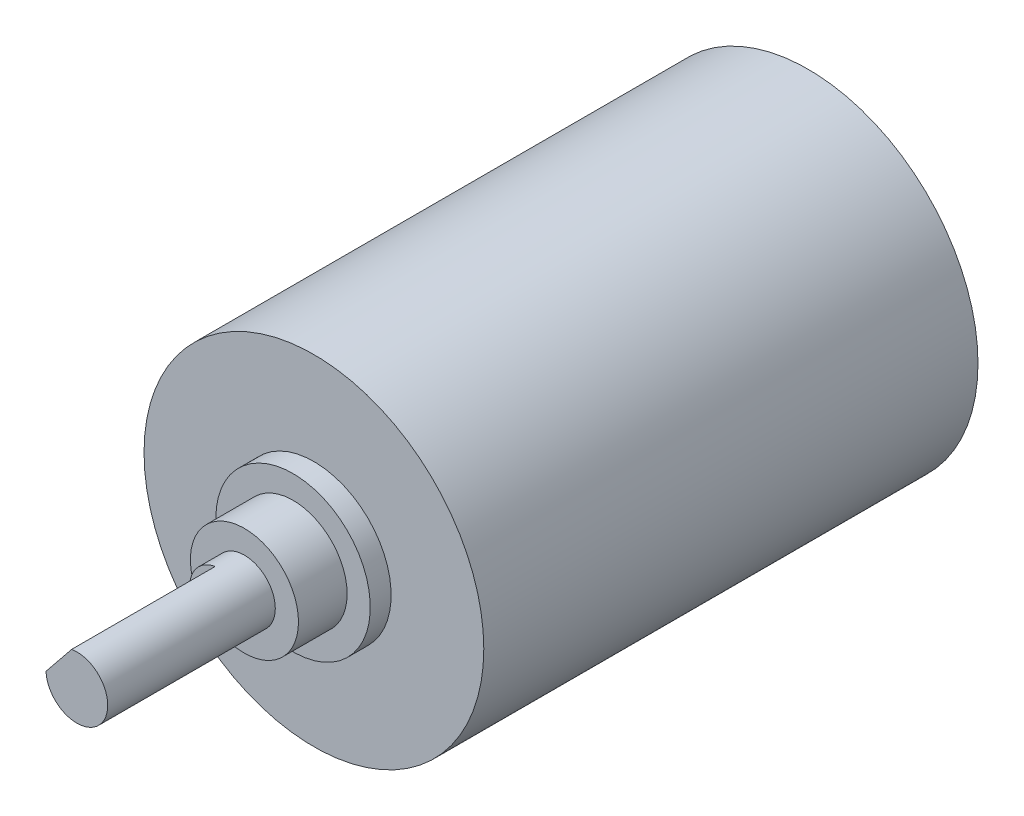
ISO-10303-21;
HEADER;
FILE_DESCRIPTION(('STEP AP214'),'2;1');
FILE_NAME('part.step','',(''),(''),'','','');
FILE_SCHEMA(('AUTOMOTIVE_DESIGN { 1 0 10303 214 1 1 1 1 }'));
ENDSEC;
DATA;
#1=APPLICATION_CONTEXT('core data for automotive mechanical design processes');
#2=APPLICATION_PROTOCOL_DEFINITION('international standard','automotive_design',2000,#1);
#3=PRODUCT_CONTEXT('',#1,'mechanical');
#4=PRODUCT('Part','Part','',(#3));
#5=PRODUCT_RELATED_PRODUCT_CATEGORY('part','',(#4));
#6=PRODUCT_DEFINITION_FORMATION('','',#4);
#7=PRODUCT_DEFINITION_CONTEXT('part definition',#1,'design');
#8=PRODUCT_DEFINITION('design','',#6,#7);
#9=PRODUCT_DEFINITION_SHAPE('','',#8);
#10=(LENGTH_UNIT() NAMED_UNIT(*) SI_UNIT(.MILLI.,.METRE.));
#11=(NAMED_UNIT(*) PLANE_ANGLE_UNIT() SI_UNIT($,.RADIAN.));
#12=(NAMED_UNIT(*) SI_UNIT($,.STERADIAN.) SOLID_ANGLE_UNIT());
#13=UNCERTAINTY_MEASURE_WITH_UNIT(LENGTH_MEASURE(1.E-05),#10,'distance_accuracy_value','');
#14=(GEOMETRIC_REPRESENTATION_CONTEXT(3) GLOBAL_UNCERTAINTY_ASSIGNED_CONTEXT((#13)) GLOBAL_UNIT_ASSIGNED_CONTEXT((#10,
#11,#12)) REPRESENTATION_CONTEXT('',''));
#15=CARTESIAN_POINT('',(0.,0.,0.));
#16=DIRECTION('',(0.,0.,1.));
#17=DIRECTION('',(1.,0.,0.));
#18=AXIS2_PLACEMENT_3D('',#15,#16,#17);
#19=CARTESIAN_POINT('',(0.,0.,32.));
#20=DIRECTION('',(0.,0.,-1.));
#21=DIRECTION('',(-1.,0.,0.));
#22=AXIS2_PLACEMENT_3D('',#19,#20,#21);
#23=CYLINDRICAL_SURFACE('',#22,11.);
#24=CARTESIAN_POINT('',(0.,0.,32.));
#25=DIRECTION('',(0.,0.,1.));
#26=DIRECTION('',(1.,0.,0.));
#27=AXIS2_PLACEMENT_3D('',#24,#25,#26);
#28=CIRCLE('',#27,11.);
#29=CARTESIAN_POINT('',(11.,0.,32.));
#30=VERTEX_POINT('',#29);
#31=EDGE_CURVE('E101',#30,#30,#28,.T.);
#32=ORIENTED_EDGE('',*,*,#31,.F.);
#33=EDGE_LOOP('',(#32));
#34=FACE_BOUND('',#33,.T.);
#35=CARTESIAN_POINT('',(0.,0.,0.));
#36=DIRECTION('',(0.,0.,1.));
#37=DIRECTION('',(1.,0.,0.));
#38=AXIS2_PLACEMENT_3D('',#35,#36,#37);
#39=CIRCLE('',#38,11.);
#40=CARTESIAN_POINT('',(11.,0.,0.));
#41=VERTEX_POINT('',#40);
#42=EDGE_CURVE('E42',#41,#41,#39,.T.);
#43=ORIENTED_EDGE('',*,*,#42,.T.);
#44=EDGE_LOOP('',(#43));
#45=FACE_BOUND('',#44,.T.);
#46=ADVANCED_FACE('F39',(#34,#45),#23,.T.);
#47=CARTESIAN_POINT('',(0.,0.,32.));
#48=DIRECTION('',(0.,0.,1.));
#49=DIRECTION('',(1.,0.,0.));
#50=AXIS2_PLACEMENT_3D('',#47,#48,#49);
#51=PLANE('',#50);
#52=CARTESIAN_POINT('',(0.,0.,32.));
#53=DIRECTION('',(0.,0.,1.));
#54=DIRECTION('',(1.,0.,0.));
#55=AXIS2_PLACEMENT_3D('',#52,#53,#54);
#56=CIRCLE('',#55,5.);
#57=CARTESIAN_POINT('',(-5.,0.,32.));
#58=VERTEX_POINT('',#57);
#59=EDGE_CURVE('E95',#58,#58,#56,.T.);
#60=ORIENTED_EDGE('',*,*,#59,.F.);
#61=EDGE_LOOP('',(#60));
#62=FACE_BOUND('',#61,.T.);
#63=ORIENTED_EDGE('',*,*,#31,.T.);
#64=EDGE_LOOP('',(#63));
#65=FACE_BOUND('',#64,.T.);
#66=ADVANCED_FACE('F114',(#62,#65),#51,.T.);
#67=CARTESIAN_POINT('',(0.,0.,0.));
#68=DIRECTION('',(0.,0.,1.));
#69=DIRECTION('',(1.,0.,0.));
#70=AXIS2_PLACEMENT_3D('',#67,#68,#69);
#71=PLANE('',#70);
#72=ORIENTED_EDGE('',*,*,#42,.F.);
#73=EDGE_LOOP('',(#72));
#74=FACE_BOUND('',#73,.T.);
#75=ADVANCED_FACE('F111',(#74),#71,.F.);
#76=CARTESIAN_POINT('',(0.,0.,33.35));
#77=DIRECTION('',(0.,0.,-1.));
#78=DIRECTION('',(-1.,0.,0.));
#79=AXIS2_PLACEMENT_3D('',#76,#77,#78);
#80=CYLINDRICAL_SURFACE('',#79,5.);
#81=CARTESIAN_POINT('',(0.,0.,33.35));
#82=DIRECTION('',(0.,0.,1.));
#83=DIRECTION('',(1.,0.,0.));
#84=AXIS2_PLACEMENT_3D('',#81,#82,#83);
#85=CIRCLE('',#84,5.);
#86=CARTESIAN_POINT('',(-5.,0.,33.35));
#87=VERTEX_POINT('',#86);
#88=EDGE_CURVE('E88',#87,#87,#85,.T.);
#89=CARTESIAN_POINT('',(-5.,0.,33.35));
#90=CARTESIAN_POINT('',(-5.,0.,33.3359375));
#91=CARTESIAN_POINT('',(-5.,0.,33.321875));
#92=CARTESIAN_POINT('',(-5.,0.,33.29375));
#93=CARTESIAN_POINT('',(-5.,0.,33.2796875));
#94=CARTESIAN_POINT('',(-5.,0.,33.2515625));
#95=CARTESIAN_POINT('',(-5.,0.,33.2375));
#96=CARTESIAN_POINT('',(-5.,0.,33.209375));
#97=CARTESIAN_POINT('',(-5.,0.,33.1953125));
#98=CARTESIAN_POINT('',(-5.,0.,33.1671875));
#99=CARTESIAN_POINT('',(-5.,0.,33.153125));
#100=CARTESIAN_POINT('',(-5.,0.,33.125));
#101=CARTESIAN_POINT('',(-5.,0.,33.1109375));
#102=CARTESIAN_POINT('',(-5.,0.,33.0828125));
#103=CARTESIAN_POINT('',(-5.,0.,33.06875));
#104=CARTESIAN_POINT('',(-5.,0.,33.040625));
#105=CARTESIAN_POINT('',(-5.,0.,33.0265625));
#106=CARTESIAN_POINT('',(-5.,0.,32.9984375));
#107=CARTESIAN_POINT('',(-5.,0.,32.984375));
#108=CARTESIAN_POINT('',(-5.,0.,32.95625));
#109=CARTESIAN_POINT('',(-5.,0.,32.9421875));
#110=CARTESIAN_POINT('',(-5.,0.,32.9140625));
#111=CARTESIAN_POINT('',(-5.,0.,32.9));
#112=CARTESIAN_POINT('',(-5.,0.,32.871875));
#113=CARTESIAN_POINT('',(-5.,0.,32.8578125));
#114=CARTESIAN_POINT('',(-5.,0.,32.8296875));
#115=CARTESIAN_POINT('',(-5.,0.,32.815625));
#116=CARTESIAN_POINT('',(-5.,0.,32.7875));
#117=CARTESIAN_POINT('',(-5.,0.,32.7734375));
#118=CARTESIAN_POINT('',(-5.,0.,32.7453125));
#119=CARTESIAN_POINT('',(-5.,0.,32.73125));
#120=CARTESIAN_POINT('',(-5.,0.,32.703125));
#121=CARTESIAN_POINT('',(-5.,0.,32.6890625));
#122=CARTESIAN_POINT('',(-5.,0.,32.6609375));
#123=CARTESIAN_POINT('',(-5.,0.,32.646875));
#124=CARTESIAN_POINT('',(-5.,0.,32.61875));
#125=CARTESIAN_POINT('',(-5.,0.,32.6046875));
#126=CARTESIAN_POINT('',(-5.,0.,32.5765625));
#127=CARTESIAN_POINT('',(-5.,0.,32.5625));
#128=CARTESIAN_POINT('',(-5.,0.,32.534375));
#129=CARTESIAN_POINT('',(-5.,0.,32.5203125));
#130=CARTESIAN_POINT('',(-5.,0.,32.4921875));
#131=CARTESIAN_POINT('',(-5.,0.,32.478125));
#132=CARTESIAN_POINT('',(-5.,0.,32.45));
#133=CARTESIAN_POINT('',(-5.,0.,32.4359375));
#134=CARTESIAN_POINT('',(-5.,0.,32.4078125));
#135=CARTESIAN_POINT('',(-5.,0.,32.39375));
#136=CARTESIAN_POINT('',(-5.,0.,32.365625));
#137=CARTESIAN_POINT('',(-5.,0.,32.3515625));
#138=CARTESIAN_POINT('',(-5.,0.,32.3234375));
#139=CARTESIAN_POINT('',(-5.,0.,32.309375));
#140=CARTESIAN_POINT('',(-5.,0.,32.28125));
#141=CARTESIAN_POINT('',(-5.,0.,32.2671875));
#142=CARTESIAN_POINT('',(-5.,0.,32.2390625));
#143=CARTESIAN_POINT('',(-5.,0.,32.225));
#144=CARTESIAN_POINT('',(-5.,0.,32.196875));
#145=CARTESIAN_POINT('',(-5.,0.,32.1828125));
#146=CARTESIAN_POINT('',(-5.,0.,32.1546875));
#147=CARTESIAN_POINT('',(-5.,0.,32.140625));
#148=CARTESIAN_POINT('',(-5.,0.,32.1125));
#149=CARTESIAN_POINT('',(-5.,0.,32.0984375));
#150=CARTESIAN_POINT('',(-5.,0.,32.0703125));
#151=CARTESIAN_POINT('',(-5.,0.,32.05625));
#152=CARTESIAN_POINT('',(-5.,0.,32.028125));
#153=CARTESIAN_POINT('',(-5.,0.,32.0140625));
#154=CARTESIAN_POINT('',(-5.,0.,32.));
#155=B_SPLINE_CURVE_WITH_KNOTS('',3,(#89,#90,#91,#92,#93,#94,#95,#96,#97,#98,#99,#100,#101,#102,
#103,#104,#105,#106,#107,#108,#109,#110,#111,#112,#113,#114,#115,#116,#117,#118,#119,#120,#121,
#122,#123,#124,#125,#126,#127,#128,#129,#130,#131,#132,#133,#134,#135,#136,#137,#138,#139,#140,
#141,#142,#143,#144,#145,#146,#147,#148,#149,#150,#151,#152,#153,#154),.UNSPECIFIED.,.F.,.F.,(4,
2,2,2,2,2,2,2,2,2,2,2,2,2,2,2,2,2,2,2,2,2,2,2,2,2,2,2,2,2,2,2,4),(0.,0.0421874999999988,
0.0843749999999976,0.126562499999996,0.168749999999995,0.210937499999994,0.253124999999993,
0.295312499999999,0.337499999999998,0.379687499999996,0.421874999999995,0.464062499999994,
0.506249999999993,0.548437499999999,0.590624999999997,0.632812499999996,0.674999999999995,
0.717187499999994,0.759374999999993,0.801562499999992,0.843749999999997,0.885937499999996,
0.928124999999995,0.970312499999994,1.01249999999999,1.05468749999999,1.096875,1.1390625,
1.18124999999999,1.22343749999999,1.26562499999999,1.30781249999999,1.35),.UNSPECIFIED.);
#156=EDGE_CURVE('BSEAM113',#87,#58,#155,.T.);
#157=ORIENTED_EDGE('',*,*,#88,.F.);
#158=ORIENTED_EDGE('',*,*,#59,.T.);
#159=ORIENTED_EDGE('',*,*,#156,.T.);
#160=ORIENTED_EDGE('',*,*,#156,.F.);
#161=EDGE_LOOP('',(#157,#159,#158,#160));
#162=FACE_BOUND('',#161,.T.);
#163=ADVANCED_FACE('F113',(#162),#80,.T.);
#164=CARTESIAN_POINT('',(0.,0.,33.35));
#165=DIRECTION('',(0.,0.,1.));
#166=DIRECTION('',(1.,0.,0.));
#167=AXIS2_PLACEMENT_3D('',#164,#165,#166);
#168=PLANE('',#167);
#169=CARTESIAN_POINT('',(0.,0.,33.35));
#170=DIRECTION('',(0.,0.,1.));
#171=DIRECTION('',(1.,0.,0.));
#172=AXIS2_PLACEMENT_3D('',#169,#170,#171);
#173=CIRCLE('',#172,3.5);
#174=CARTESIAN_POINT('',(3.5,0.,33.35));
#175=VERTEX_POINT('',#174);
#176=EDGE_CURVE('E48',#175,#175,#173,.T.);
#177=ORIENTED_EDGE('',*,*,#176,.F.);
#178=EDGE_LOOP('',(#177));
#179=FACE_BOUND('',#178,.T.);
#180=ORIENTED_EDGE('',*,*,#88,.T.);
#181=EDGE_LOOP('',(#180));
#182=FACE_BOUND('',#181,.T.);
#183=ADVANCED_FACE('F119',(#179,#182),#168,.T.);
#184=CARTESIAN_POINT('',(0.,0.,36.5));
#185=DIRECTION('',(0.,0.,-1.));
#186=DIRECTION('',(-1.,0.,0.));
#187=AXIS2_PLACEMENT_3D('',#184,#185,#186);
#188=CYLINDRICAL_SURFACE('',#187,3.5);
#189=CARTESIAN_POINT('',(0.,0.,36.5));
#190=DIRECTION('',(0.,0.,1.));
#191=DIRECTION('',(1.,0.,0.));
#192=AXIS2_PLACEMENT_3D('',#189,#190,#191);
#193=CIRCLE('',#192,3.5);
#194=CARTESIAN_POINT('',(3.5,0.,36.5));
#195=VERTEX_POINT('',#194);
#196=EDGE_CURVE('E84',#195,#195,#193,.T.);
#197=ORIENTED_EDGE('',*,*,#196,.F.);
#198=EDGE_LOOP('',(#197));
#199=FACE_BOUND('',#198,.T.);
#200=ORIENTED_EDGE('',*,*,#176,.T.);
#201=EDGE_LOOP('',(#200));
#202=FACE_BOUND('',#201,.T.);
#203=ADVANCED_FACE('F149',(#199,#202),#188,.T.);
#204=CARTESIAN_POINT('',(0.,0.,36.5));
#205=DIRECTION('',(0.,0.,1.));
#206=DIRECTION('',(1.,0.,0.));
#207=AXIS2_PLACEMENT_3D('',#204,#205,#206);
#208=PLANE('',#207);
#209=CARTESIAN_POINT('',(0.,0.,36.5));
#210=DIRECTION('',(0.,0.,1.));
#211=DIRECTION('',(1.,0.,0.));
#212=AXIS2_PLACEMENT_3D('',#209,#210,#211);
#213=CIRCLE('',#212,2.);
#214=CARTESIAN_POINT('',(2.,0.,36.5));
#215=VERTEX_POINT('',#214);
#216=EDGE_CURVE('E11',#215,#215,#213,.T.);
#217=ORIENTED_EDGE('',*,*,#216,.F.);
#218=EDGE_LOOP('',(#217));
#219=FACE_BOUND('',#218,.T.);
#220=ORIENTED_EDGE('',*,*,#196,.T.);
#221=EDGE_LOOP('',(#220));
#222=FACE_BOUND('',#221,.T.);
#223=ADVANCED_FACE('F159',(#219,#222),#208,.T.);
#224=CARTESIAN_POINT('',(0.,0.,47.35));
#225=DIRECTION('',(0.,0.,-1.));
#226=DIRECTION('',(-1.,0.,0.));
#227=AXIS2_PLACEMENT_3D('',#224,#225,#226);
#228=CYLINDRICAL_SURFACE('',#227,2.);
#229=CARTESIAN_POINT('',(0.,0.,47.35));
#230=DIRECTION('',(0.,0.,1.));
#231=DIRECTION('',(1.,0.,0.));
#232=AXIS2_PLACEMENT_3D('',#229,#230,#231);
#233=CIRCLE('',#232,2.);
#234=CARTESIAN_POINT('',(-1.99802063006399,-0.088958202762341,47.35));
#235=VERTEX_POINT('',#234);
#236=CARTESIAN_POINT('',(-0.338013059353659,1.97122986272691,47.35));
#237=VERTEX_POINT('',#236);
#238=EDGE_CURVE('E79',#235,#237,#233,.T.);
#239=ORIENTED_EDGE('',*,*,#238,.F.);
#240=DIRECTION('',(0.,0.,1.));
#241=VECTOR('',#240,1.);
#242=CARTESIAN_POINT('',(-1.99802063006399,-0.0889582027623414,38.05));
#243=LINE('',#242,#241);
#244=CARTESIAN_POINT('',(-1.99802063006399,-0.0889582027623414,38.05));
#245=VERTEX_POINT('',#244);
#246=EDGE_CURVE('E56',#245,#235,#243,.T.);
#247=ORIENTED_EDGE('',*,*,#246,.F.);
#248=CARTESIAN_POINT('',(0.,0.,38.05));
#249=DIRECTION('',(0.,0.,1.));
#250=DIRECTION('',(1.,0.,0.));
#251=AXIS2_PLACEMENT_3D('',#248,#249,#250);
#252=CIRCLE('',#251,2.);
#253=CARTESIAN_POINT('',(-0.338013059353659,1.97122986272691,38.05));
#254=VERTEX_POINT('',#253);
#255=EDGE_CURVE('E73',#254,#245,#252,.T.);
#256=ORIENTED_EDGE('',*,*,#255,.F.);
#257=DIRECTION('',(0.,0.,1.));
#258=VECTOR('',#257,1.);
#259=CARTESIAN_POINT('',(-0.338013059353659,1.97122986272691,38.05));
#260=LINE('',#259,#258);
#261=EDGE_CURVE('E62',#254,#237,#260,.T.);
#262=ORIENTED_EDGE('',*,*,#261,.T.);
#263=EDGE_LOOP('',(#239,#247,#256,#262));
#264=FACE_BOUND('',#263,.T.);
#265=ORIENTED_EDGE('',*,*,#216,.T.);
#266=EDGE_LOOP('',(#265));
#267=FACE_BOUND('',#266,.T.);
#268=ADVANCED_FACE('F77',(#264,#267),#228,.T.);
#269=CARTESIAN_POINT('',(0.,0.,47.35));
#270=DIRECTION('',(0.,0.,1.));
#271=DIRECTION('',(1.,0.,0.));
#272=AXIS2_PLACEMENT_3D('',#269,#270,#271);
#273=PLANE('',#272);
#274=DIRECTION('',(0.627423886654858,0.778677896472548,0.));
#275=VECTOR('',#274,1.);
#276=CARTESIAN_POINT('',(-0.338013059353659,1.97122986272691,47.35));
#277=LINE('',#276,#275);
#278=EDGE_CURVE('E67',#235,#237,#277,.T.);
#279=ORIENTED_EDGE('',*,*,#278,.F.);
#280=ORIENTED_EDGE('',*,*,#238,.T.);
#281=EDGE_LOOP('',(#279,#280));
#282=FACE_BOUND('',#281,.T.);
#283=ADVANCED_FACE('F82',(#282),#273,.T.);
#284=CARTESIAN_POINT('',(-0.338013059353659,1.97122986272691,38.05));
#285=DIRECTION('',(0.778677896472548,-0.627423886654858,0.));
#286=DIRECTION('',(0.627423886654858,0.778677896472548,0.));
#287=AXIS2_PLACEMENT_3D('',#284,#285,#286);
#288=PLANE('',#287);
#289=ORIENTED_EDGE('',*,*,#278,.T.);
#290=ORIENTED_EDGE('',*,*,#261,.F.);
#291=DIRECTION('',(0.627423886654858,0.778677896472548,0.));
#292=VECTOR('',#291,1.);
#293=CARTESIAN_POINT('',(-0.338013059353659,1.97122986272691,38.05));
#294=LINE('',#293,#292);
#295=EDGE_CURVE('E207',#245,#254,#294,.T.);
#296=ORIENTED_EDGE('',*,*,#295,.F.);
#297=ORIENTED_EDGE('',*,*,#246,.T.);
#298=EDGE_LOOP('',(#289,#290,#296,#297));
#299=FACE_BOUND('',#298,.T.);
#300=ADVANCED_FACE('F68',(#299),#288,.F.);
#301=CARTESIAN_POINT('',(0.,0.,38.05));
#302=DIRECTION('',(0.,0.,1.));
#303=DIRECTION('',(1.,0.,0.));
#304=AXIS2_PLACEMENT_3D('',#301,#302,#303);
#305=PLANE('',#304);
#306=ORIENTED_EDGE('',*,*,#255,.T.);
#307=ORIENTED_EDGE('',*,*,#295,.T.);
#308=EDGE_LOOP('',(#306,#307));
#309=FACE_BOUND('',#308,.T.);
#310=ADVANCED_FACE('F194',(#309),#305,.T.);
#311=CLOSED_SHELL('',(#46,#66,#75,#163,#183,#203,#223,#268,#283,#300,#310));
#312=MANIFOLD_SOLID_BREP('B2',#311);
#313=ADVANCED_BREP_SHAPE_REPRESENTATION('',(#18,#312),#14);
#314=SHAPE_DEFINITION_REPRESENTATION(#9,#313);
ENDSEC;
END-ISO-10303-21;
